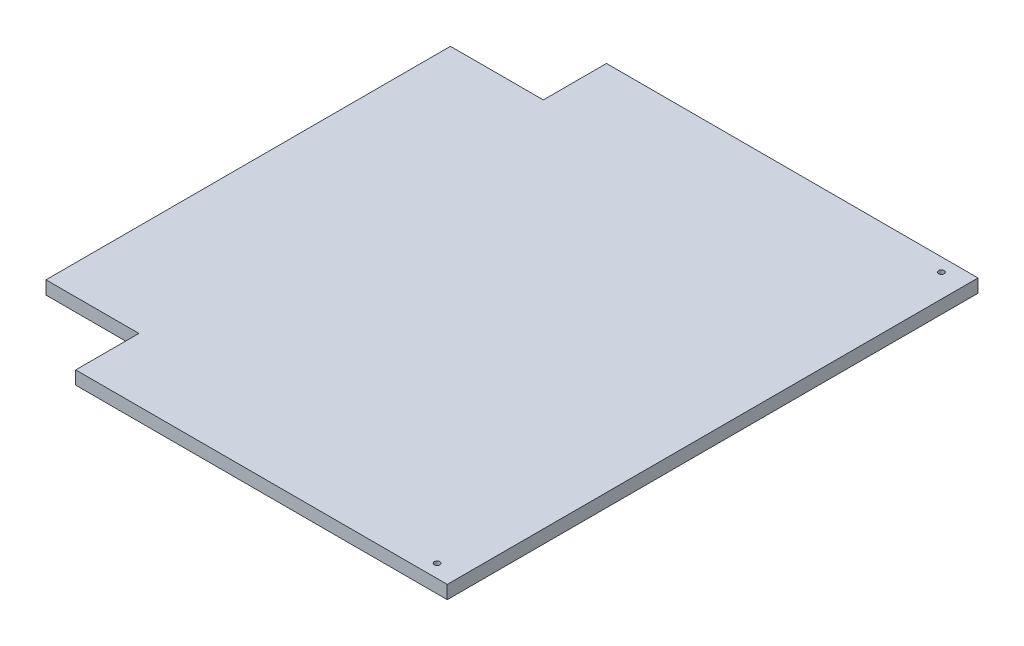
ISO-10303-21;
HEADER;
FILE_DESCRIPTION(('STEP AP214'),'2;1');
FILE_NAME('part.step','',(''),(''),'','','');
FILE_SCHEMA(('AUTOMOTIVE_DESIGN { 1 0 10303 214 1 1 1 1 }'));
ENDSEC;
DATA;
#1=APPLICATION_CONTEXT('core data for automotive mechanical design processes');
#2=APPLICATION_PROTOCOL_DEFINITION('international standard','automotive_design',2000,#1);
#3=PRODUCT_CONTEXT('',#1,'mechanical');
#4=PRODUCT('Part','Part','',(#3));
#5=PRODUCT_RELATED_PRODUCT_CATEGORY('part','',(#4));
#6=PRODUCT_DEFINITION_FORMATION('','',#4);
#7=PRODUCT_DEFINITION_CONTEXT('part definition',#1,'design');
#8=PRODUCT_DEFINITION('design','',#6,#7);
#9=PRODUCT_DEFINITION_SHAPE('','',#8);
#10=(LENGTH_UNIT() NAMED_UNIT(*) SI_UNIT(.MILLI.,.METRE.));
#11=(NAMED_UNIT(*) PLANE_ANGLE_UNIT() SI_UNIT($,.RADIAN.));
#12=(NAMED_UNIT(*) SI_UNIT($,.STERADIAN.) SOLID_ANGLE_UNIT());
#13=UNCERTAINTY_MEASURE_WITH_UNIT(LENGTH_MEASURE(1.E-05),#10,'distance_accuracy_value','');
#14=(GEOMETRIC_REPRESENTATION_CONTEXT(3) GLOBAL_UNCERTAINTY_ASSIGNED_CONTEXT((#13)) GLOBAL_UNIT_ASSIGNED_CONTEXT((#10,
#11,#12)) REPRESENTATION_CONTEXT('',''));
#15=CARTESIAN_POINT('',(0.,0.,0.));
#16=DIRECTION('',(0.,0.,1.));
#17=DIRECTION('',(1.,0.,0.));
#18=AXIS2_PLACEMENT_3D('',#15,#16,#17);
#19=CARTESIAN_POINT('',(-222.25,6.35,-254.));
#20=DIRECTION('',(1.,0.,0.));
#21=DIRECTION('',(0.,0.,-1.));
#22=AXIS2_PLACEMENT_3D('',#19,#20,#21);
#23=PLANE('',#22);
#24=DIRECTION('',(0.,1.,0.));
#25=VECTOR('',#24,1.);
#26=CARTESIAN_POINT('',(-222.25,-224.536,193.548));
#27=LINE('',#26,#25);
#28=CARTESIAN_POINT('',(-222.25,-6.35000000000005,193.548));
#29=VERTEX_POINT('',#28);
#30=CARTESIAN_POINT('',(-222.25,6.35,193.548));
#31=VERTEX_POINT('',#30);
#32=EDGE_CURVE('E190',#29,#31,#27,.T.);
#33=ORIENTED_EDGE('',*,*,#32,.T.);
#34=DIRECTION('',(0.,0.,1.));
#35=VECTOR('',#34,1.);
#36=CARTESIAN_POINT('',(-222.25,6.35,-254.));
#37=LINE('',#36,#35);
#38=CARTESIAN_POINT('',(-222.25,6.35,-193.548));
#39=VERTEX_POINT('',#38);
#40=EDGE_CURVE('E128',#39,#31,#37,.T.);
#41=ORIENTED_EDGE('',*,*,#40,.F.);
#42=DIRECTION('',(0.,1.,0.));
#43=VECTOR('',#42,1.);
#44=CARTESIAN_POINT('',(-222.25,-224.536,-193.548));
#45=LINE('',#44,#43);
#46=CARTESIAN_POINT('',(-222.25,-6.35000000000005,-193.548));
#47=VERTEX_POINT('',#46);
#48=EDGE_CURVE('E202',#47,#39,#45,.T.);
#49=ORIENTED_EDGE('',*,*,#48,.F.);
#50=DIRECTION('',(0.,0.,1.));
#51=VECTOR('',#50,1.);
#52=CARTESIAN_POINT('',(-222.25,-6.35,-254.));
#53=LINE('',#52,#51);
#54=EDGE_CURVE('E142',#47,#29,#53,.T.);
#55=ORIENTED_EDGE('',*,*,#54,.T.);
#56=EDGE_LOOP('',(#33,#41,#49,#55));
#57=FACE_BOUND('',#56,.T.);
#58=ADVANCED_FACE('F39',(#57),#23,.F.);
#59=CARTESIAN_POINT('',(-222.25,6.35,254.));
#60=DIRECTION('',(0.,0.,-1.));
#61=DIRECTION('',(-1.,0.,0.));
#62=AXIS2_PLACEMENT_3D('',#59,#60,#61);
#63=PLANE('',#62);
#64=DIRECTION('',(0.,1.,0.));
#65=VECTOR('',#64,1.);
#66=CARTESIAN_POINT('',(-133.35,-224.536,254.));
#67=LINE('',#66,#65);
#68=CARTESIAN_POINT('',(-133.35,-6.35000000000005,254.));
#69=VERTEX_POINT('',#68);
#70=CARTESIAN_POINT('',(-133.35,6.35,254.));
#71=VERTEX_POINT('',#70);
#72=EDGE_CURVE('E103',#69,#71,#67,.T.);
#73=ORIENTED_EDGE('',*,*,#72,.F.);
#74=DIRECTION('',(1.,0.,0.));
#75=VECTOR('',#74,1.);
#76=CARTESIAN_POINT('',(-222.25,-6.35,254.));
#77=LINE('',#76,#75);
#78=CARTESIAN_POINT('',(222.25,-6.35,254.));
#79=VERTEX_POINT('',#78);
#80=EDGE_CURVE('E146',#69,#79,#77,.T.);
#81=ORIENTED_EDGE('',*,*,#80,.T.);
#82=DIRECTION('',(0.,-1.,0.));
#83=VECTOR('',#82,1.);
#84=CARTESIAN_POINT('',(222.25,6.35,254.));
#85=LINE('',#84,#83);
#86=CARTESIAN_POINT('',(222.25,6.35,254.));
#87=VERTEX_POINT('',#86);
#88=EDGE_CURVE('E124',#87,#79,#85,.T.);
#89=ORIENTED_EDGE('',*,*,#88,.F.);
#90=DIRECTION('',(1.,0.,0.));
#91=VECTOR('',#90,1.);
#92=CARTESIAN_POINT('',(-222.25,6.35,254.));
#93=LINE('',#92,#91);
#94=EDGE_CURVE('E118',#71,#87,#93,.T.);
#95=ORIENTED_EDGE('',*,*,#94,.F.);
#96=EDGE_LOOP('',(#73,#81,#89,#95));
#97=FACE_BOUND('',#96,.T.);
#98=ADVANCED_FACE('F122',(#97),#63,.F.);
#99=CARTESIAN_POINT('',(0.,6.35,0.));
#100=DIRECTION('',(0.,1.,0.));
#101=DIRECTION('',(0.,0.,1.));
#102=AXIS2_PLACEMENT_3D('',#99,#100,#101);
#103=PLANE('',#102);
#104=CARTESIAN_POINT('',(199.898,6.35,241.3));
#105=DIRECTION('',(0.,1.,0.));
#106=DIRECTION('',(0.,0.,1.));
#107=AXIS2_PLACEMENT_3D('',#104,#105,#106);
#108=CIRCLE('',#107,2.66699999999997);
#109=CARTESIAN_POINT('',(199.898,6.35000000000002,243.967));
#110=VERTEX_POINT('',#109);
#111=EDGE_CURVE('E173',#110,#110,#108,.T.);
#112=ORIENTED_EDGE('',*,*,#111,.F.);
#113=EDGE_LOOP('',(#112));
#114=FACE_BOUND('',#113,.T.);
#115=CARTESIAN_POINT('',(199.898,6.35,-241.3));
#116=DIRECTION('',(0.,1.,0.));
#117=DIRECTION('',(0.,0.,1.));
#118=AXIS2_PLACEMENT_3D('',#115,#116,#117);
#119=CIRCLE('',#118,2.66699999999997);
#120=CARTESIAN_POINT('',(199.898,6.35000000000002,-238.633));
#121=VERTEX_POINT('',#120);
#122=EDGE_CURVE('E180',#121,#121,#119,.T.);
#123=ORIENTED_EDGE('',*,*,#122,.F.);
#124=EDGE_LOOP('',(#123));
#125=FACE_BOUND('',#124,.T.);
#126=ORIENTED_EDGE('',*,*,#40,.T.);
#127=DIRECTION('',(1.,0.,0.));
#128=VECTOR('',#127,1.);
#129=CARTESIAN_POINT('',(-222.25,6.35,193.548));
#130=LINE('',#129,#128);
#131=CARTESIAN_POINT('',(-133.35,6.35,193.548));
#132=VERTEX_POINT('',#131);
#133=EDGE_CURVE('E113',#31,#132,#130,.T.);
#134=ORIENTED_EDGE('',*,*,#133,.T.);
#135=DIRECTION('',(0.,0.,1.));
#136=VECTOR('',#135,1.);
#137=CARTESIAN_POINT('',(-133.35,6.35,254.));
#138=LINE('',#137,#136);
#139=EDGE_CURVE('E106',#132,#71,#138,.T.);
#140=ORIENTED_EDGE('',*,*,#139,.T.);
#141=ORIENTED_EDGE('',*,*,#94,.T.);
#142=DIRECTION('',(0.,0.,-1.));
#143=VECTOR('',#142,1.);
#144=CARTESIAN_POINT('',(222.25,6.35,-254.));
#145=LINE('',#144,#143);
#146=CARTESIAN_POINT('',(222.25,6.35,-254.));
#147=VERTEX_POINT('',#146);
#148=EDGE_CURVE('E127',#87,#147,#145,.T.);
#149=ORIENTED_EDGE('',*,*,#148,.T.);
#150=DIRECTION('',(-1.,0.,0.));
#151=VECTOR('',#150,1.);
#152=CARTESIAN_POINT('',(-222.25,6.35,-254.));
#153=LINE('',#152,#151);
#154=CARTESIAN_POINT('',(-133.35,6.35,-254.));
#155=VERTEX_POINT('',#154);
#156=EDGE_CURVE('E132',#147,#155,#153,.T.);
#157=ORIENTED_EDGE('',*,*,#156,.T.);
#158=DIRECTION('',(0.,0.,-1.));
#159=VECTOR('',#158,1.);
#160=CARTESIAN_POINT('',(-133.35,6.35,-254.));
#161=LINE('',#160,#159);
#162=CARTESIAN_POINT('',(-133.35,6.35,-193.548));
#163=VERTEX_POINT('',#162);
#164=EDGE_CURVE('E199',#163,#155,#161,.T.);
#165=ORIENTED_EDGE('',*,*,#164,.F.);
#166=DIRECTION('',(1.,0.,0.));
#167=VECTOR('',#166,1.);
#168=CARTESIAN_POINT('',(-222.25,6.35,-193.548));
#169=LINE('',#168,#167);
#170=EDGE_CURVE('E194',#39,#163,#169,.T.);
#171=ORIENTED_EDGE('',*,*,#170,.F.);
#172=EDGE_LOOP('',(#126,#134,#140,#141,#149,#157,#165,#171));
#173=FACE_BOUND('',#172,.T.);
#174=ADVANCED_FACE('F117',(#114,#125,#173),#103,.T.);
#175=CARTESIAN_POINT('',(0.,-6.35,0.));
#176=DIRECTION('',(0.,1.,0.));
#177=DIRECTION('',(0.,0.,1.));
#178=AXIS2_PLACEMENT_3D('',#175,#176,#177);
#179=PLANE('',#178);
#180=CARTESIAN_POINT('',(199.898,-6.34999999999999,241.3));
#181=DIRECTION('',(0.,1.,0.));
#182=DIRECTION('',(0.,0.,1.));
#183=AXIS2_PLACEMENT_3D('',#180,#181,#182);
#184=CIRCLE('',#183,2.66699999999997);
#185=CARTESIAN_POINT('',(199.898,-6.35000000000002,243.967));
#186=VERTEX_POINT('',#185);
#187=EDGE_CURVE('E42',#186,#186,#184,.T.);
#188=ORIENTED_EDGE('',*,*,#187,.T.);
#189=EDGE_LOOP('',(#188));
#190=FACE_BOUND('',#189,.T.);
#191=CARTESIAN_POINT('',(199.898,-6.34999999999999,-241.3));
#192=DIRECTION('',(0.,1.,0.));
#193=DIRECTION('',(0.,0.,1.));
#194=AXIS2_PLACEMENT_3D('',#191,#192,#193);
#195=CIRCLE('',#194,2.66699999999997);
#196=CARTESIAN_POINT('',(199.898,-6.35000000000002,-238.633));
#197=VERTEX_POINT('',#196);
#198=EDGE_CURVE('E170',#197,#197,#195,.T.);
#199=ORIENTED_EDGE('',*,*,#198,.T.);
#200=EDGE_LOOP('',(#199));
#201=FACE_BOUND('',#200,.T.);
#202=DIRECTION('',(1.,0.,0.));
#203=VECTOR('',#202,1.);
#204=CARTESIAN_POINT('',(0.,-6.35,193.548));
#205=LINE('',#204,#203);
#206=CARTESIAN_POINT('',(-133.35,-6.35,193.548));
#207=VERTEX_POINT('',#206);
#208=EDGE_CURVE('E11',#29,#207,#205,.T.);
#209=ORIENTED_EDGE('',*,*,#208,.F.);
#210=ORIENTED_EDGE('',*,*,#54,.F.);
#211=DIRECTION('',(1.,0.,0.));
#212=VECTOR('',#211,1.);
#213=CARTESIAN_POINT('',(0.,-6.35,-193.548));
#214=LINE('',#213,#212);
#215=CARTESIAN_POINT('',(-133.35,-6.35,-193.548));
#216=VERTEX_POINT('',#215);
#217=EDGE_CURVE('E161',#47,#216,#214,.T.);
#218=ORIENTED_EDGE('',*,*,#217,.T.);
#219=DIRECTION('',(0.,0.,-1.));
#220=VECTOR('',#219,1.);
#221=CARTESIAN_POINT('',(-133.35,-6.35,0.));
#222=LINE('',#221,#220);
#223=CARTESIAN_POINT('',(-133.35,-6.35000000000005,-254.));
#224=VERTEX_POINT('',#223);
#225=EDGE_CURVE('E165',#216,#224,#222,.T.);
#226=ORIENTED_EDGE('',*,*,#225,.T.);
#227=DIRECTION('',(-1.,0.,0.));
#228=VECTOR('',#227,1.);
#229=CARTESIAN_POINT('',(-222.25,-6.35,-254.));
#230=LINE('',#229,#228);
#231=CARTESIAN_POINT('',(222.25,-6.35,-254.));
#232=VERTEX_POINT('',#231);
#233=EDGE_CURVE('E134',#232,#224,#230,.T.);
#234=ORIENTED_EDGE('',*,*,#233,.F.);
#235=DIRECTION('',(0.,0.,-1.));
#236=VECTOR('',#235,1.);
#237=CARTESIAN_POINT('',(222.25,-6.35,-254.));
#238=LINE('',#237,#236);
#239=EDGE_CURVE('E150',#79,#232,#238,.T.);
#240=ORIENTED_EDGE('',*,*,#239,.F.);
#241=ORIENTED_EDGE('',*,*,#80,.F.);
#242=DIRECTION('',(0.,0.,1.));
#243=VECTOR('',#242,1.);
#244=CARTESIAN_POINT('',(-133.35,-6.35,0.));
#245=LINE('',#244,#243);
#246=EDGE_CURVE('E48',#207,#69,#245,.T.);
#247=ORIENTED_EDGE('',*,*,#246,.F.);
#248=EDGE_LOOP('',(#209,#210,#218,#226,#234,#240,#241,#247));
#249=FACE_BOUND('',#248,.T.);
#250=ADVANCED_FACE('F219',(#190,#201,#249),#179,.F.);
#251=CARTESIAN_POINT('',(222.25,6.35,-254.));
#252=DIRECTION('',(-1.,0.,0.));
#253=DIRECTION('',(0.,0.,1.));
#254=AXIS2_PLACEMENT_3D('',#251,#252,#253);
#255=PLANE('',#254);
#256=ORIENTED_EDGE('',*,*,#239,.T.);
#257=DIRECTION('',(0.,-1.,0.));
#258=VECTOR('',#257,1.);
#259=CARTESIAN_POINT('',(222.25,6.35,-254.));
#260=LINE('',#259,#258);
#261=EDGE_CURVE('E141',#147,#232,#260,.T.);
#262=ORIENTED_EDGE('',*,*,#261,.F.);
#263=ORIENTED_EDGE('',*,*,#148,.F.);
#264=ORIENTED_EDGE('',*,*,#88,.T.);
#265=EDGE_LOOP('',(#256,#262,#263,#264));
#266=FACE_BOUND('',#265,.T.);
#267=ADVANCED_FACE('F223',(#266),#255,.F.);
#268=CARTESIAN_POINT('',(-222.25,6.35,-254.));
#269=DIRECTION('',(0.,0.,1.));
#270=DIRECTION('',(1.,0.,0.));
#271=AXIS2_PLACEMENT_3D('',#268,#269,#270);
#272=PLANE('',#271);
#273=ORIENTED_EDGE('',*,*,#233,.T.);
#274=DIRECTION('',(0.,1.,0.));
#275=VECTOR('',#274,1.);
#276=CARTESIAN_POINT('',(-133.35,-224.536,-254.));
#277=LINE('',#276,#275);
#278=EDGE_CURVE('E147',#224,#155,#277,.T.);
#279=ORIENTED_EDGE('',*,*,#278,.T.);
#280=ORIENTED_EDGE('',*,*,#156,.F.);
#281=ORIENTED_EDGE('',*,*,#261,.T.);
#282=EDGE_LOOP('',(#273,#279,#280,#281));
#283=FACE_BOUND('',#282,.T.);
#284=ADVANCED_FACE('F227',(#283),#272,.F.);
#285=CARTESIAN_POINT('',(-133.35,-224.536,-254.));
#286=DIRECTION('',(1.,0.,0.));
#287=DIRECTION('',(0.,0.,-1.));
#288=AXIS2_PLACEMENT_3D('',#285,#286,#287);
#289=PLANE('',#288);
#290=DIRECTION('',(0.,1.,0.));
#291=VECTOR('',#290,1.);
#292=CARTESIAN_POINT('',(-133.35,-224.536,-193.548));
#293=LINE('',#292,#291);
#294=EDGE_CURVE('E63',#216,#163,#293,.T.);
#295=ORIENTED_EDGE('',*,*,#294,.T.);
#296=ORIENTED_EDGE('',*,*,#164,.T.);
#297=ORIENTED_EDGE('',*,*,#278,.F.);
#298=ORIENTED_EDGE('',*,*,#225,.F.);
#299=EDGE_LOOP('',(#295,#296,#297,#298));
#300=FACE_BOUND('',#299,.T.);
#301=ADVANCED_FACE('F229',(#300),#289,.F.);
#302=CARTESIAN_POINT('',(-222.25,-224.536,-193.548));
#303=DIRECTION('',(0.,0.,1.));
#304=DIRECTION('',(1.,0.,0.));
#305=AXIS2_PLACEMENT_3D('',#302,#303,#304);
#306=PLANE('',#305);
#307=ORIENTED_EDGE('',*,*,#48,.T.);
#308=ORIENTED_EDGE('',*,*,#170,.T.);
#309=ORIENTED_EDGE('',*,*,#294,.F.);
#310=ORIENTED_EDGE('',*,*,#217,.F.);
#311=EDGE_LOOP('',(#307,#308,#309,#310));
#312=FACE_BOUND('',#311,.T.);
#313=ADVANCED_FACE('F210',(#312),#306,.F.);
#314=CARTESIAN_POINT('',(-222.25,-224.536,193.548));
#315=DIRECTION('',(0.,0.,1.));
#316=DIRECTION('',(1.,0.,0.));
#317=AXIS2_PLACEMENT_3D('',#314,#315,#316);
#318=PLANE('',#317);
#319=ORIENTED_EDGE('',*,*,#208,.T.);
#320=DIRECTION('',(0.,1.,0.));
#321=VECTOR('',#320,1.);
#322=CARTESIAN_POINT('',(-133.35,-224.536,193.548));
#323=LINE('',#322,#321);
#324=EDGE_CURVE('E56',#207,#132,#323,.T.);
#325=ORIENTED_EDGE('',*,*,#324,.T.);
#326=ORIENTED_EDGE('',*,*,#133,.F.);
#327=ORIENTED_EDGE('',*,*,#32,.F.);
#328=EDGE_LOOP('',(#319,#325,#326,#327));
#329=FACE_BOUND('',#328,.T.);
#330=ADVANCED_FACE('F217',(#329),#318,.T.);
#331=CARTESIAN_POINT('',(-133.35,-224.536,254.));
#332=DIRECTION('',(-1.,0.,0.));
#333=DIRECTION('',(0.,0.,1.));
#334=AXIS2_PLACEMENT_3D('',#331,#332,#333);
#335=PLANE('',#334);
#336=ORIENTED_EDGE('',*,*,#246,.T.);
#337=ORIENTED_EDGE('',*,*,#72,.T.);
#338=ORIENTED_EDGE('',*,*,#139,.F.);
#339=ORIENTED_EDGE('',*,*,#324,.F.);
#340=EDGE_LOOP('',(#336,#337,#338,#339));
#341=FACE_BOUND('',#340,.T.);
#342=ADVANCED_FACE('F105',(#341),#335,.T.);
#343=CARTESIAN_POINT('',(199.898,-224.536,-241.3));
#344=DIRECTION('',(0.,1.,0.));
#345=DIRECTION('',(0.,0.,1.));
#346=AXIS2_PLACEMENT_3D('',#343,#344,#345);
#347=CYLINDRICAL_SURFACE('',#346,2.66699999999997);
#348=CARTESIAN_POINT('',(199.898,6.35000000000002,-238.633));
#349=CARTESIAN_POINT('',(199.898,6.21770833333336,-238.633));
#350=CARTESIAN_POINT('',(199.898,6.08541666666669,-238.633));
#351=CARTESIAN_POINT('',(199.898,5.82083333333336,-238.633));
#352=CARTESIAN_POINT('',(199.898,5.68854166666669,-238.633));
#353=CARTESIAN_POINT('',(199.898,5.42395833333335,-238.633));
#354=CARTESIAN_POINT('',(199.898,5.29166666666668,-238.633));
#355=CARTESIAN_POINT('',(199.898,5.02708333333335,-238.633));
#356=CARTESIAN_POINT('',(199.898,4.89479166666668,-238.633));
#357=CARTESIAN_POINT('',(199.898,4.63020833333334,-238.633));
#358=CARTESIAN_POINT('',(199.898,4.49791666666668,-238.633));
#359=CARTESIAN_POINT('',(199.898,4.23333333333335,-238.633));
#360=CARTESIAN_POINT('',(199.898,4.10104166666668,-238.633));
#361=CARTESIAN_POINT('',(199.898,3.83645833333335,-238.633));
#362=CARTESIAN_POINT('',(199.898,3.70416666666668,-238.633));
#363=CARTESIAN_POINT('',(199.898,3.43958333333334,-238.633));
#364=CARTESIAN_POINT('',(199.898,3.30729166666667,-238.633));
#365=CARTESIAN_POINT('',(199.898,3.04270833333335,-238.633));
#366=CARTESIAN_POINT('',(199.898,2.91041666666668,-238.633));
#367=CARTESIAN_POINT('',(199.898,2.64583333333335,-238.633));
#368=CARTESIAN_POINT('',(199.898,2.51354166666667,-238.633));
#369=CARTESIAN_POINT('',(199.898,2.24895833333334,-238.633));
#370=CARTESIAN_POINT('',(199.898,2.11666666666667,-238.633));
#371=CARTESIAN_POINT('',(199.898,1.85208333333335,-238.633));
#372=CARTESIAN_POINT('',(199.898,1.71979166666668,-238.633));
#373=CARTESIAN_POINT('',(199.898,1.45520833333335,-238.633));
#374=CARTESIAN_POINT('',(199.898,1.32291666666667,-238.633));
#375=CARTESIAN_POINT('',(199.898,1.05833333333334,-238.633));
#376=CARTESIAN_POINT('',(199.898,0.926041666666673,-238.633));
#377=CARTESIAN_POINT('',(199.898,0.661458333333337,-238.633));
#378=CARTESIAN_POINT('',(199.898,0.529166666666664,-238.633));
#379=CARTESIAN_POINT('',(199.898,0.264583333333327,-238.633));
#380=CARTESIAN_POINT('',(199.898,0.132291666666664,-238.633));
#381=CARTESIAN_POINT('',(199.898,-0.132291666666664,-238.633));
#382=CARTESIAN_POINT('',(199.898,-0.264583333333327,-238.633));
#383=CARTESIAN_POINT('',(199.898,-0.529166666666664,-238.633));
#384=CARTESIAN_POINT('',(199.898,-0.661458333333337,-238.633));
#385=CARTESIAN_POINT('',(199.898,-0.926041666666673,-238.633));
#386=CARTESIAN_POINT('',(199.898,-1.05833333333334,-238.633));
#387=CARTESIAN_POINT('',(199.898,-1.32291666666667,-238.633));
#388=CARTESIAN_POINT('',(199.898,-1.45520833333335,-238.633));
#389=CARTESIAN_POINT('',(199.898,-1.71979166666668,-238.633));
#390=CARTESIAN_POINT('',(199.898,-1.85208333333335,-238.633));
#391=CARTESIAN_POINT('',(199.898,-2.11666666666667,-238.633));
#392=CARTESIAN_POINT('',(199.898,-2.24895833333334,-238.633));
#393=CARTESIAN_POINT('',(199.898,-2.51354166666667,-238.633));
#394=CARTESIAN_POINT('',(199.898,-2.64583333333335,-238.633));
#395=CARTESIAN_POINT('',(199.898,-2.91041666666668,-238.633));
#396=CARTESIAN_POINT('',(199.898,-3.04270833333335,-238.633));
#397=CARTESIAN_POINT('',(199.898,-3.30729166666667,-238.633));
#398=CARTESIAN_POINT('',(199.898,-3.43958333333334,-238.633));
#399=CARTESIAN_POINT('',(199.898,-3.70416666666668,-238.633));
#400=CARTESIAN_POINT('',(199.898,-3.83645833333335,-238.633));
#401=CARTESIAN_POINT('',(199.898,-4.10104166666668,-238.633));
#402=CARTESIAN_POINT('',(199.898,-4.23333333333335,-238.633));
#403=CARTESIAN_POINT('',(199.898,-4.49791666666668,-238.633));
#404=CARTESIAN_POINT('',(199.898,-4.63020833333334,-238.633));
#405=CARTESIAN_POINT('',(199.898,-4.89479166666668,-238.633));
#406=CARTESIAN_POINT('',(199.898,-5.02708333333335,-238.633));
#407=CARTESIAN_POINT('',(199.898,-5.29166666666668,-238.633));
#408=CARTESIAN_POINT('',(199.898,-5.42395833333335,-238.633));
#409=CARTESIAN_POINT('',(199.898,-5.68854166666669,-238.633));
#410=CARTESIAN_POINT('',(199.898,-5.82083333333336,-238.633));
#411=CARTESIAN_POINT('',(199.898,-6.08541666666669,-238.633));
#412=CARTESIAN_POINT('',(199.898,-6.21770833333336,-238.633));
#413=CARTESIAN_POINT('',(199.898,-6.35000000000002,-238.633));
#414=B_SPLINE_CURVE_WITH_KNOTS('',3,(#348,#349,#350,#351,#352,#353,#354,#355,#356,#357,#358,
#359,#360,#361,#362,#363,#364,#365,#366,#367,#368,#369,#370,#371,#372,#373,#374,#375,#376,#377,
#378,#379,#380,#381,#382,#383,#384,#385,#386,#387,#388,#389,#390,#391,#392,#393,#394,#395,#396,
#397,#398,#399,#400,#401,#402,#403,#404,#405,#406,#407,#408,#409,#410,#411,#412,#413),
.UNSPECIFIED.,.F.,.F.,(4,2,2,2,2,2,2,2,2,2,2,2,2,2,2,2,2,2,2,2,2,2,2,2,2,2,2,2,2,2,2,2,4),(0.,
0.396874999999991,0.79375000000001,1.190625,1.58750000000002,1.98437500000001,2.38125,
2.77812500000002,3.17500000000001,3.571875,3.96875000000002,4.36562500000001,4.7625,
5.15937500000002,5.55625000000001,5.95312500000003,6.35000000000002,6.74687500000001,
7.14375000000003,7.54062500000002,7.93750000000004,8.33437500000003,8.73125000000002,
9.12812500000004,9.52500000000003,9.92187500000002,10.31875,10.715625,11.1125,11.509375,
11.90625,12.3031250000001,12.7),.UNSPECIFIED.);
#415=EDGE_CURVE('BSEAM259',#121,#197,#414,.T.);
#416=ORIENTED_EDGE('',*,*,#122,.T.);
#417=ORIENTED_EDGE('',*,*,#198,.F.);
#418=ORIENTED_EDGE('',*,*,#415,.T.);
#419=ORIENTED_EDGE('',*,*,#415,.F.);
#420=EDGE_LOOP('',(#416,#418,#417,#419));
#421=FACE_BOUND('',#420,.T.);
#422=ADVANCED_FACE('F259',(#421),#347,.F.);
#423=CARTESIAN_POINT('',(199.898,-224.536,241.3));
#424=DIRECTION('',(0.,1.,0.));
#425=DIRECTION('',(0.,0.,1.));
#426=AXIS2_PLACEMENT_3D('',#423,#424,#425);
#427=CYLINDRICAL_SURFACE('',#426,2.66699999999997);
#428=CARTESIAN_POINT('',(199.898,6.35000000000002,243.967));
#429=CARTESIAN_POINT('',(199.898,6.21770833333336,243.967));
#430=CARTESIAN_POINT('',(199.898,6.08541666666669,243.967));
#431=CARTESIAN_POINT('',(199.898,5.82083333333336,243.967));
#432=CARTESIAN_POINT('',(199.898,5.68854166666669,243.967));
#433=CARTESIAN_POINT('',(199.898,5.42395833333335,243.967));
#434=CARTESIAN_POINT('',(199.898,5.29166666666668,243.967));
#435=CARTESIAN_POINT('',(199.898,5.02708333333335,243.967));
#436=CARTESIAN_POINT('',(199.898,4.89479166666668,243.967));
#437=CARTESIAN_POINT('',(199.898,4.63020833333334,243.967));
#438=CARTESIAN_POINT('',(199.898,4.49791666666668,243.967));
#439=CARTESIAN_POINT('',(199.898,4.23333333333335,243.967));
#440=CARTESIAN_POINT('',(199.898,4.10104166666668,243.967));
#441=CARTESIAN_POINT('',(199.898,3.83645833333335,243.967));
#442=CARTESIAN_POINT('',(199.898,3.70416666666668,243.967));
#443=CARTESIAN_POINT('',(199.898,3.43958333333334,243.967));
#444=CARTESIAN_POINT('',(199.898,3.30729166666667,243.967));
#445=CARTESIAN_POINT('',(199.898,3.04270833333335,243.967));
#446=CARTESIAN_POINT('',(199.898,2.91041666666668,243.967));
#447=CARTESIAN_POINT('',(199.898,2.64583333333335,243.967));
#448=CARTESIAN_POINT('',(199.898,2.51354166666667,243.967));
#449=CARTESIAN_POINT('',(199.898,2.24895833333334,243.967));
#450=CARTESIAN_POINT('',(199.898,2.11666666666667,243.967));
#451=CARTESIAN_POINT('',(199.898,1.85208333333335,243.967));
#452=CARTESIAN_POINT('',(199.898,1.71979166666668,243.967));
#453=CARTESIAN_POINT('',(199.898,1.45520833333335,243.967));
#454=CARTESIAN_POINT('',(199.898,1.32291666666667,243.967));
#455=CARTESIAN_POINT('',(199.898,1.05833333333334,243.967));
#456=CARTESIAN_POINT('',(199.898,0.926041666666673,243.967));
#457=CARTESIAN_POINT('',(199.898,0.661458333333337,243.967));
#458=CARTESIAN_POINT('',(199.898,0.529166666666664,243.967));
#459=CARTESIAN_POINT('',(199.898,0.264583333333327,243.967));
#460=CARTESIAN_POINT('',(199.898,0.132291666666664,243.967));
#461=CARTESIAN_POINT('',(199.898,-0.132291666666664,243.967));
#462=CARTESIAN_POINT('',(199.898,-0.264583333333327,243.967));
#463=CARTESIAN_POINT('',(199.898,-0.529166666666664,243.967));
#464=CARTESIAN_POINT('',(199.898,-0.661458333333337,243.967));
#465=CARTESIAN_POINT('',(199.898,-0.926041666666673,243.967));
#466=CARTESIAN_POINT('',(199.898,-1.05833333333334,243.967));
#467=CARTESIAN_POINT('',(199.898,-1.32291666666667,243.967));
#468=CARTESIAN_POINT('',(199.898,-1.45520833333335,243.967));
#469=CARTESIAN_POINT('',(199.898,-1.71979166666668,243.967));
#470=CARTESIAN_POINT('',(199.898,-1.85208333333335,243.967));
#471=CARTESIAN_POINT('',(199.898,-2.11666666666667,243.967));
#472=CARTESIAN_POINT('',(199.898,-2.24895833333334,243.967));
#473=CARTESIAN_POINT('',(199.898,-2.51354166666667,243.967));
#474=CARTESIAN_POINT('',(199.898,-2.64583333333335,243.967));
#475=CARTESIAN_POINT('',(199.898,-2.91041666666668,243.967));
#476=CARTESIAN_POINT('',(199.898,-3.04270833333335,243.967));
#477=CARTESIAN_POINT('',(199.898,-3.30729166666667,243.967));
#478=CARTESIAN_POINT('',(199.898,-3.43958333333334,243.967));
#479=CARTESIAN_POINT('',(199.898,-3.70416666666668,243.967));
#480=CARTESIAN_POINT('',(199.898,-3.83645833333335,243.967));
#481=CARTESIAN_POINT('',(199.898,-4.10104166666668,243.967));
#482=CARTESIAN_POINT('',(199.898,-4.23333333333335,243.967));
#483=CARTESIAN_POINT('',(199.898,-4.49791666666668,243.967));
#484=CARTESIAN_POINT('',(199.898,-4.63020833333334,243.967));
#485=CARTESIAN_POINT('',(199.898,-4.89479166666668,243.967));
#486=CARTESIAN_POINT('',(199.898,-5.02708333333335,243.967));
#487=CARTESIAN_POINT('',(199.898,-5.29166666666668,243.967));
#488=CARTESIAN_POINT('',(199.898,-5.42395833333335,243.967));
#489=CARTESIAN_POINT('',(199.898,-5.68854166666669,243.967));
#490=CARTESIAN_POINT('',(199.898,-5.82083333333336,243.967));
#491=CARTESIAN_POINT('',(199.898,-6.08541666666669,243.967));
#492=CARTESIAN_POINT('',(199.898,-6.21770833333336,243.967));
#493=CARTESIAN_POINT('',(199.898,-6.35000000000002,243.967));
#494=B_SPLINE_CURVE_WITH_KNOTS('',3,(#428,#429,#430,#431,#432,#433,#434,#435,#436,#437,#438,
#439,#440,#441,#442,#443,#444,#445,#446,#447,#448,#449,#450,#451,#452,#453,#454,#455,#456,#457,
#458,#459,#460,#461,#462,#463,#464,#465,#466,#467,#468,#469,#470,#471,#472,#473,#474,#475,#476,
#477,#478,#479,#480,#481,#482,#483,#484,#485,#486,#487,#488,#489,#490,#491,#492,#493),
.UNSPECIFIED.,.F.,.F.,(4,2,2,2,2,2,2,2,2,2,2,2,2,2,2,2,2,2,2,2,2,2,2,2,2,2,2,2,2,2,2,2,4),(0.,
0.396874999999991,0.79375000000001,1.190625,1.58750000000002,1.98437500000001,2.38125,
2.77812500000002,3.17500000000001,3.571875,3.96875000000002,4.36562500000001,4.7625,
5.15937500000002,5.55625000000001,5.95312500000003,6.35000000000002,6.74687500000001,
7.14375000000003,7.54062500000002,7.93750000000004,8.33437500000003,8.73125000000002,
9.12812500000004,9.52500000000003,9.92187500000002,10.31875,10.715625,11.1125,11.509375,
11.90625,12.3031250000001,12.7),.UNSPECIFIED.);
#495=EDGE_CURVE('BSEAM257',#110,#186,#494,.T.);
#496=ORIENTED_EDGE('',*,*,#111,.T.);
#497=ORIENTED_EDGE('',*,*,#187,.F.);
#498=ORIENTED_EDGE('',*,*,#495,.T.);
#499=ORIENTED_EDGE('',*,*,#495,.F.);
#500=EDGE_LOOP('',(#496,#498,#497,#499));
#501=FACE_BOUND('',#500,.T.);
#502=ADVANCED_FACE('F257',(#501),#427,.F.);
#503=CLOSED_SHELL('',(#58,#98,#174,#250,#267,#284,#301,#313,#330,#342,#422,#502));
#504=MANIFOLD_SOLID_BREP('B2',#503);
#505=ADVANCED_BREP_SHAPE_REPRESENTATION('',(#18,#504),#14);
#506=SHAPE_DEFINITION_REPRESENTATION(#9,#505);
ENDSEC;
END-ISO-10303-21;
